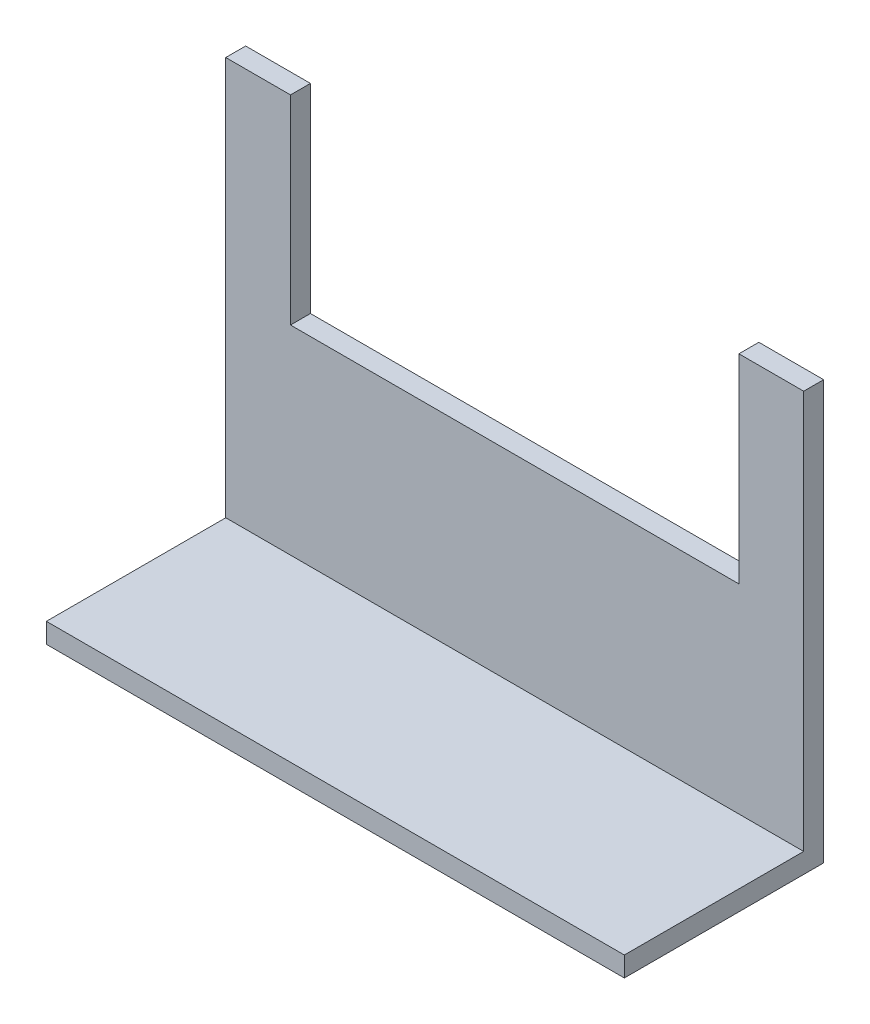
ISO-10303-21;
HEADER;
FILE_DESCRIPTION(('STEP AP214'),'2;1');
FILE_NAME('part.step','',(''),(''),'','','');
FILE_SCHEMA(('AUTOMOTIVE_DESIGN { 1 0 10303 214 1 1 1 1 }'));
ENDSEC;
DATA;
#1=APPLICATION_CONTEXT('core data for automotive mechanical design processes');
#2=APPLICATION_PROTOCOL_DEFINITION('international standard','automotive_design',2000,#1);
#3=PRODUCT_CONTEXT('',#1,'mechanical');
#4=PRODUCT('Part','Part','',(#3));
#5=PRODUCT_RELATED_PRODUCT_CATEGORY('part','',(#4));
#6=PRODUCT_DEFINITION_FORMATION('','',#4);
#7=PRODUCT_DEFINITION_CONTEXT('part definition',#1,'design');
#8=PRODUCT_DEFINITION('design','',#6,#7);
#9=PRODUCT_DEFINITION_SHAPE('','',#8);
#10=(LENGTH_UNIT() NAMED_UNIT(*) SI_UNIT(.MILLI.,.METRE.));
#11=(NAMED_UNIT(*) PLANE_ANGLE_UNIT() SI_UNIT($,.RADIAN.));
#12=(NAMED_UNIT(*) SI_UNIT($,.STERADIAN.) SOLID_ANGLE_UNIT());
#13=UNCERTAINTY_MEASURE_WITH_UNIT(LENGTH_MEASURE(1.E-05),#10,'distance_accuracy_value','');
#14=(GEOMETRIC_REPRESENTATION_CONTEXT(3) GLOBAL_UNCERTAINTY_ASSIGNED_CONTEXT((#13)) GLOBAL_UNIT_ASSIGNED_CONTEXT((#10,
#11,#12)) REPRESENTATION_CONTEXT('',''));
#15=CARTESIAN_POINT('',(0.,0.,0.));
#16=DIRECTION('',(0.,0.,1.));
#17=DIRECTION('',(1.,0.,0.));
#18=AXIS2_PLACEMENT_3D('',#15,#16,#17);
#19=CARTESIAN_POINT('',(-29.,2.,-10.));
#20=DIRECTION('',(0.,0.,1.));
#21=DIRECTION('',(1.,0.,0.));
#22=AXIS2_PLACEMENT_3D('',#19,#20,#21);
#23=PLANE('',#22);
#24=DIRECTION('',(0.,-1.,0.));
#25=VECTOR('',#24,1.);
#26=CARTESIAN_POINT('',(22.5,2.,-10.));
#27=LINE('',#26,#25);
#28=CARTESIAN_POINT('',(22.5,42.,-9.99999999999999));
#29=VERTEX_POINT('',#28);
#30=CARTESIAN_POINT('',(22.5,22.,-9.99999999999999));
#31=VERTEX_POINT('',#30);
#32=EDGE_CURVE('E204',#29,#31,#27,.T.);
#33=ORIENTED_EDGE('',*,*,#32,.F.);
#34=DIRECTION('',(-1.,0.,0.));
#35=VECTOR('',#34,1.);
#36=CARTESIAN_POINT('',(-29.,42.,-10.));
#37=LINE('',#36,#35);
#38=CARTESIAN_POINT('',(29.,42.,-10.));
#39=VERTEX_POINT('',#38);
#40=EDGE_CURVE('E127',#39,#29,#37,.T.);
#41=ORIENTED_EDGE('',*,*,#40,.F.);
#42=DIRECTION('',(0.,-1.,0.));
#43=VECTOR('',#42,1.);
#44=CARTESIAN_POINT('',(29.,2.,-10.));
#45=LINE('',#44,#43);
#46=CARTESIAN_POINT('',(29.,0.,-10.));
#47=VERTEX_POINT('',#46);
#48=EDGE_CURVE('E162',#39,#47,#45,.T.);
#49=ORIENTED_EDGE('',*,*,#48,.T.);
#50=DIRECTION('',(-1.,0.,0.));
#51=VECTOR('',#50,1.);
#52=CARTESIAN_POINT('',(-29.,0.,-10.));
#53=LINE('',#52,#51);
#54=CARTESIAN_POINT('',(-29.,0.,-10.));
#55=VERTEX_POINT('',#54);
#56=EDGE_CURVE('E185',#47,#55,#53,.T.);
#57=ORIENTED_EDGE('',*,*,#56,.T.);
#58=DIRECTION('',(0.,-1.,0.));
#59=VECTOR('',#58,1.);
#60=CARTESIAN_POINT('',(-29.,2.,-10.));
#61=LINE('',#60,#59);
#62=CARTESIAN_POINT('',(-29.,42.,-10.));
#63=VERTEX_POINT('',#62);
#64=EDGE_CURVE('E166',#63,#55,#61,.T.);
#65=ORIENTED_EDGE('',*,*,#64,.F.);
#66=CARTESIAN_POINT('',(-22.5,42.,-10.));
#67=VERTEX_POINT('',#66);
#68=EDGE_CURVE('E142',#67,#63,#37,.T.);
#69=ORIENTED_EDGE('',*,*,#68,.F.);
#70=DIRECTION('',(0.,-1.,0.));
#71=VECTOR('',#70,1.);
#72=CARTESIAN_POINT('',(-22.5,2.,-10.));
#73=LINE('',#72,#71);
#74=CARTESIAN_POINT('',(-22.5,22.,-9.99999999999999));
#75=VERTEX_POINT('',#74);
#76=EDGE_CURVE('E47',#67,#75,#73,.T.);
#77=ORIENTED_EDGE('',*,*,#76,.T.);
#78=DIRECTION('',(1.,0.,0.));
#79=VECTOR('',#78,1.);
#80=CARTESIAN_POINT('',(-29.,22.,-10.));
#81=LINE('',#80,#79);
#82=EDGE_CURVE('E151',#75,#31,#81,.T.);
#83=ORIENTED_EDGE('',*,*,#82,.T.);
#84=EDGE_LOOP('',(#33,#41,#49,#57,#65,#69,#77,#83));
#85=FACE_BOUND('',#84,.T.);
#86=ADVANCED_FACE('F32',(#85),#23,.F.);
#87=CARTESIAN_POINT('',(-29.,42.,-8.));
#88=DIRECTION('',(0.,0.,-1.));
#89=DIRECTION('',(-1.,0.,0.));
#90=AXIS2_PLACEMENT_3D('',#87,#88,#89);
#91=PLANE('',#90);
#92=DIRECTION('',(0.,-1.,0.));
#93=VECTOR('',#92,1.);
#94=CARTESIAN_POINT('',(22.5,0.,-8.));
#95=LINE('',#94,#93);
#96=CARTESIAN_POINT('',(22.5,42.,-8.));
#97=VERTEX_POINT('',#96);
#98=CARTESIAN_POINT('',(22.5,22.,-8.));
#99=VERTEX_POINT('',#98);
#100=EDGE_CURVE('E109',#97,#99,#95,.T.);
#101=ORIENTED_EDGE('',*,*,#100,.T.);
#102=DIRECTION('',(1.,0.,0.));
#103=VECTOR('',#102,1.);
#104=CARTESIAN_POINT('',(0.,22.,-8.));
#105=LINE('',#104,#103);
#106=CARTESIAN_POINT('',(-22.5,22.,-8.));
#107=VERTEX_POINT('',#106);
#108=EDGE_CURVE('E210',#107,#99,#105,.T.);
#109=ORIENTED_EDGE('',*,*,#108,.F.);
#110=DIRECTION('',(0.,-1.,0.));
#111=VECTOR('',#110,1.);
#112=CARTESIAN_POINT('',(-22.5,0.,-8.));
#113=LINE('',#112,#111);
#114=CARTESIAN_POINT('',(-22.5,42.,-8.));
#115=VERTEX_POINT('',#114);
#116=EDGE_CURVE('E118',#115,#107,#113,.T.);
#117=ORIENTED_EDGE('',*,*,#116,.F.);
#118=DIRECTION('',(1.,0.,0.));
#119=VECTOR('',#118,1.);
#120=CARTESIAN_POINT('',(-29.,42.,-8.));
#121=LINE('',#120,#119);
#122=CARTESIAN_POINT('',(-29.,42.,-8.));
#123=VERTEX_POINT('',#122);
#124=EDGE_CURVE('E132',#123,#115,#121,.T.);
#125=ORIENTED_EDGE('',*,*,#124,.F.);
#126=DIRECTION('',(0.,-1.,0.));
#127=VECTOR('',#126,1.);
#128=CARTESIAN_POINT('',(-29.,42.,-8.));
#129=LINE('',#128,#127);
#130=CARTESIAN_POINT('',(-29.,2.,-8.));
#131=VERTEX_POINT('',#130);
#132=EDGE_CURVE('E155',#123,#131,#129,.T.);
#133=ORIENTED_EDGE('',*,*,#132,.T.);
#134=DIRECTION('',(1.,0.,0.));
#135=VECTOR('',#134,1.);
#136=CARTESIAN_POINT('',(-29.,2.,-8.));
#137=LINE('',#136,#135);
#138=CARTESIAN_POINT('',(29.,2.,-8.));
#139=VERTEX_POINT('',#138);
#140=EDGE_CURVE('E55',#131,#139,#137,.T.);
#141=ORIENTED_EDGE('',*,*,#140,.T.);
#142=DIRECTION('',(0.,-1.,0.));
#143=VECTOR('',#142,1.);
#144=CARTESIAN_POINT('',(29.,42.,-8.));
#145=LINE('',#144,#143);
#146=CARTESIAN_POINT('',(29.,42.,-8.));
#147=VERTEX_POINT('',#146);
#148=EDGE_CURVE('E130',#147,#139,#145,.T.);
#149=ORIENTED_EDGE('',*,*,#148,.F.);
#150=EDGE_CURVE('E124',#97,#147,#121,.T.);
#151=ORIENTED_EDGE('',*,*,#150,.F.);
#152=EDGE_LOOP('',(#101,#109,#117,#125,#133,#141,#149,#151));
#153=FACE_BOUND('',#152,.T.);
#154=ADVANCED_FACE('F128',(#153),#91,.F.);
#155=CARTESIAN_POINT('',(0.,42.,0.));
#156=DIRECTION('',(0.,1.,0.));
#157=DIRECTION('',(0.,0.,1.));
#158=AXIS2_PLACEMENT_3D('',#155,#156,#157);
#159=PLANE('',#158);
#160=ORIENTED_EDGE('',*,*,#40,.T.);
#161=DIRECTION('',(0.,0.,1.));
#162=VECTOR('',#161,1.);
#163=CARTESIAN_POINT('',(22.5,42.,0.));
#164=LINE('',#163,#162);
#165=EDGE_CURVE('E11',#29,#97,#164,.T.);
#166=ORIENTED_EDGE('',*,*,#165,.T.);
#167=ORIENTED_EDGE('',*,*,#150,.T.);
#168=DIRECTION('',(0.,0.,-1.));
#169=VECTOR('',#168,1.);
#170=CARTESIAN_POINT('',(29.,42.,-10.));
#171=LINE('',#170,#169);
#172=EDGE_CURVE('E136',#147,#39,#171,.T.);
#173=ORIENTED_EDGE('',*,*,#172,.T.);
#174=EDGE_LOOP('',(#160,#166,#167,#173));
#175=FACE_BOUND('',#174,.T.);
#176=ADVANCED_FACE('F122',(#175),#159,.T.);
#177=CARTESIAN_POINT('',(29.,2.,-10.));
#178=DIRECTION('',(-1.,0.,0.));
#179=DIRECTION('',(0.,0.,1.));
#180=AXIS2_PLACEMENT_3D('',#177,#178,#179);
#181=PLANE('',#180);
#182=DIRECTION('',(0.,0.,-1.));
#183=VECTOR('',#182,1.);
#184=CARTESIAN_POINT('',(29.,0.,-10.));
#185=LINE('',#184,#183);
#186=CARTESIAN_POINT('',(29.,0.,10.));
#187=VERTEX_POINT('',#186);
#188=EDGE_CURVE('E160',#187,#47,#185,.T.);
#189=ORIENTED_EDGE('',*,*,#188,.T.);
#190=ORIENTED_EDGE('',*,*,#48,.F.);
#191=ORIENTED_EDGE('',*,*,#172,.F.);
#192=ORIENTED_EDGE('',*,*,#148,.T.);
#193=DIRECTION('',(0.,0.,-1.));
#194=VECTOR('',#193,1.);
#195=CARTESIAN_POINT('',(29.,2.,-10.));
#196=LINE('',#195,#194);
#197=CARTESIAN_POINT('',(29.,2.,10.));
#198=VERTEX_POINT('',#197);
#199=EDGE_CURVE('E174',#198,#139,#196,.T.);
#200=ORIENTED_EDGE('',*,*,#199,.F.);
#201=DIRECTION('',(0.,-1.,0.));
#202=VECTOR('',#201,1.);
#203=CARTESIAN_POINT('',(29.,2.,10.));
#204=LINE('',#203,#202);
#205=EDGE_CURVE('E189',#198,#187,#204,.T.);
#206=ORIENTED_EDGE('',*,*,#205,.T.);
#207=EDGE_LOOP('',(#189,#190,#191,#192,#200,#206));
#208=FACE_BOUND('',#207,.T.);
#209=ADVANCED_FACE('F34',(#208),#181,.F.);
#210=CARTESIAN_POINT('',(-29.,2.,-10.));
#211=DIRECTION('',(1.,0.,0.));
#212=DIRECTION('',(0.,0.,-1.));
#213=AXIS2_PLACEMENT_3D('',#210,#211,#212);
#214=PLANE('',#213);
#215=DIRECTION('',(0.,0.,1.));
#216=VECTOR('',#215,1.);
#217=CARTESIAN_POINT('',(-29.,0.,-10.));
#218=LINE('',#217,#216);
#219=CARTESIAN_POINT('',(-29.,0.,10.));
#220=VERTEX_POINT('',#219);
#221=EDGE_CURVE('E178',#55,#220,#218,.T.);
#222=ORIENTED_EDGE('',*,*,#221,.T.);
#223=DIRECTION('',(0.,-1.,0.));
#224=VECTOR('',#223,1.);
#225=CARTESIAN_POINT('',(-29.,2.,10.));
#226=LINE('',#225,#224);
#227=CARTESIAN_POINT('',(-29.,2.,10.));
#228=VERTEX_POINT('',#227);
#229=EDGE_CURVE('E171',#228,#220,#226,.T.);
#230=ORIENTED_EDGE('',*,*,#229,.F.);
#231=DIRECTION('',(0.,0.,1.));
#232=VECTOR('',#231,1.);
#233=CARTESIAN_POINT('',(-29.,2.,-10.));
#234=LINE('',#233,#232);
#235=EDGE_CURVE('E152',#131,#228,#234,.T.);
#236=ORIENTED_EDGE('',*,*,#235,.F.);
#237=ORIENTED_EDGE('',*,*,#132,.F.);
#238=DIRECTION('',(0.,0.,1.));
#239=VECTOR('',#238,1.);
#240=CARTESIAN_POINT('',(-29.,42.,-10.));
#241=LINE('',#240,#239);
#242=EDGE_CURVE('E133',#63,#123,#241,.T.);
#243=ORIENTED_EDGE('',*,*,#242,.F.);
#244=ORIENTED_EDGE('',*,*,#64,.T.);
#245=EDGE_LOOP('',(#222,#230,#236,#237,#243,#244));
#246=FACE_BOUND('',#245,.T.);
#247=ADVANCED_FACE('F233',(#246),#214,.F.);
#248=CARTESIAN_POINT('',(-29.,2.,10.));
#249=DIRECTION('',(0.,0.,-1.));
#250=DIRECTION('',(-1.,0.,0.));
#251=AXIS2_PLACEMENT_3D('',#248,#249,#250);
#252=PLANE('',#251);
#253=DIRECTION('',(1.,0.,0.));
#254=VECTOR('',#253,1.);
#255=CARTESIAN_POINT('',(-29.,0.,10.));
#256=LINE('',#255,#254);
#257=EDGE_CURVE('E175',#220,#187,#256,.T.);
#258=ORIENTED_EDGE('',*,*,#257,.T.);
#259=ORIENTED_EDGE('',*,*,#205,.F.);
#260=DIRECTION('',(1.,0.,0.));
#261=VECTOR('',#260,1.);
#262=CARTESIAN_POINT('',(-29.,2.,10.));
#263=LINE('',#262,#261);
#264=EDGE_CURVE('E177',#228,#198,#263,.T.);
#265=ORIENTED_EDGE('',*,*,#264,.F.);
#266=ORIENTED_EDGE('',*,*,#229,.T.);
#267=EDGE_LOOP('',(#258,#259,#265,#266));
#268=FACE_BOUND('',#267,.T.);
#269=ADVANCED_FACE('F192',(#268),#252,.F.);
#270=CARTESIAN_POINT('',(0.,2.,0.));
#271=DIRECTION('',(0.,1.,0.));
#272=DIRECTION('',(0.,0.,1.));
#273=AXIS2_PLACEMENT_3D('',#270,#271,#272);
#274=PLANE('',#273);
#275=ORIENTED_EDGE('',*,*,#140,.F.);
#276=ORIENTED_EDGE('',*,*,#235,.T.);
#277=ORIENTED_EDGE('',*,*,#264,.T.);
#278=ORIENTED_EDGE('',*,*,#199,.T.);
#279=EDGE_LOOP('',(#275,#276,#277,#278));
#280=FACE_BOUND('',#279,.T.);
#281=ADVANCED_FACE('F202',(#280),#274,.T.);
#282=CARTESIAN_POINT('',(0.,0.,0.));
#283=DIRECTION('',(0.,1.,0.));
#284=DIRECTION('',(0.,0.,1.));
#285=AXIS2_PLACEMENT_3D('',#282,#283,#284);
#286=PLANE('',#285);
#287=ORIENTED_EDGE('',*,*,#188,.F.);
#288=ORIENTED_EDGE('',*,*,#257,.F.);
#289=ORIENTED_EDGE('',*,*,#221,.F.);
#290=ORIENTED_EDGE('',*,*,#56,.F.);
#291=EDGE_LOOP('',(#287,#288,#289,#290));
#292=FACE_BOUND('',#291,.T.);
#293=ADVANCED_FACE('F197',(#292),#286,.F.);
#294=DIRECTION('',(0.,0.,1.));
#295=VECTOR('',#294,1.);
#296=CARTESIAN_POINT('',(-22.5,42.,0.));
#297=LINE('',#296,#295);
#298=EDGE_CURVE('E40',#67,#115,#297,.T.);
#299=ORIENTED_EDGE('',*,*,#298,.F.);
#300=ORIENTED_EDGE('',*,*,#68,.T.);
#301=ORIENTED_EDGE('',*,*,#242,.T.);
#302=ORIENTED_EDGE('',*,*,#124,.T.);
#303=EDGE_LOOP('',(#299,#300,#301,#302));
#304=FACE_BOUND('',#303,.T.);
#305=ADVANCED_FACE('F217',(#304),#159,.T.);
#306=CARTESIAN_POINT('',(0.,22.,-68.));
#307=DIRECTION('',(0.,-1.,0.));
#308=DIRECTION('',(0.,0.,-1.));
#309=AXIS2_PLACEMENT_3D('',#306,#307,#308);
#310=PLANE('',#309);
#311=DIRECTION('',(0.,0.,1.));
#312=VECTOR('',#311,1.);
#313=CARTESIAN_POINT('',(-22.5,22.,-68.));
#314=LINE('',#313,#312);
#315=EDGE_CURVE('E208',#75,#107,#314,.T.);
#316=ORIENTED_EDGE('',*,*,#315,.T.);
#317=ORIENTED_EDGE('',*,*,#108,.T.);
#318=DIRECTION('',(0.,0.,1.));
#319=VECTOR('',#318,1.);
#320=CARTESIAN_POINT('',(22.5,22.,-68.));
#321=LINE('',#320,#319);
#322=EDGE_CURVE('E113',#31,#99,#321,.T.);
#323=ORIENTED_EDGE('',*,*,#322,.F.);
#324=ORIENTED_EDGE('',*,*,#82,.F.);
#325=EDGE_LOOP('',(#316,#317,#323,#324));
#326=FACE_BOUND('',#325,.T.);
#327=ADVANCED_FACE('F215',(#326),#310,.F.);
#328=CARTESIAN_POINT('',(22.5,0.,-68.));
#329=DIRECTION('',(-1.,0.,0.));
#330=DIRECTION('',(0.,-1.,0.));
#331=AXIS2_PLACEMENT_3D('',#328,#329,#330);
#332=PLANE('',#331);
#333=ORIENTED_EDGE('',*,*,#32,.T.);
#334=ORIENTED_EDGE('',*,*,#322,.T.);
#335=ORIENTED_EDGE('',*,*,#100,.F.);
#336=ORIENTED_EDGE('',*,*,#165,.F.);
#337=EDGE_LOOP('',(#333,#334,#335,#336));
#338=FACE_BOUND('',#337,.T.);
#339=ADVANCED_FACE('F110',(#338),#332,.T.);
#340=CARTESIAN_POINT('',(-22.5,0.,-68.));
#341=DIRECTION('',(-1.,0.,0.));
#342=DIRECTION('',(0.,-1.,0.));
#343=AXIS2_PLACEMENT_3D('',#340,#341,#342);
#344=PLANE('',#343);
#345=ORIENTED_EDGE('',*,*,#298,.T.);
#346=ORIENTED_EDGE('',*,*,#116,.T.);
#347=ORIENTED_EDGE('',*,*,#315,.F.);
#348=ORIENTED_EDGE('',*,*,#76,.F.);
#349=EDGE_LOOP('',(#345,#346,#347,#348));
#350=FACE_BOUND('',#349,.T.);
#351=ADVANCED_FACE('F213',(#350),#344,.F.);
#352=CLOSED_SHELL('',(#86,#154,#176,#209,#247,#269,#281,#293,#305,#327,#339,#351));
#353=MANIFOLD_SOLID_BREP('B2',#352);
#354=ADVANCED_BREP_SHAPE_REPRESENTATION('',(#18,#353),#14);
#355=SHAPE_DEFINITION_REPRESENTATION(#9,#354);
ENDSEC;
END-ISO-10303-21;
